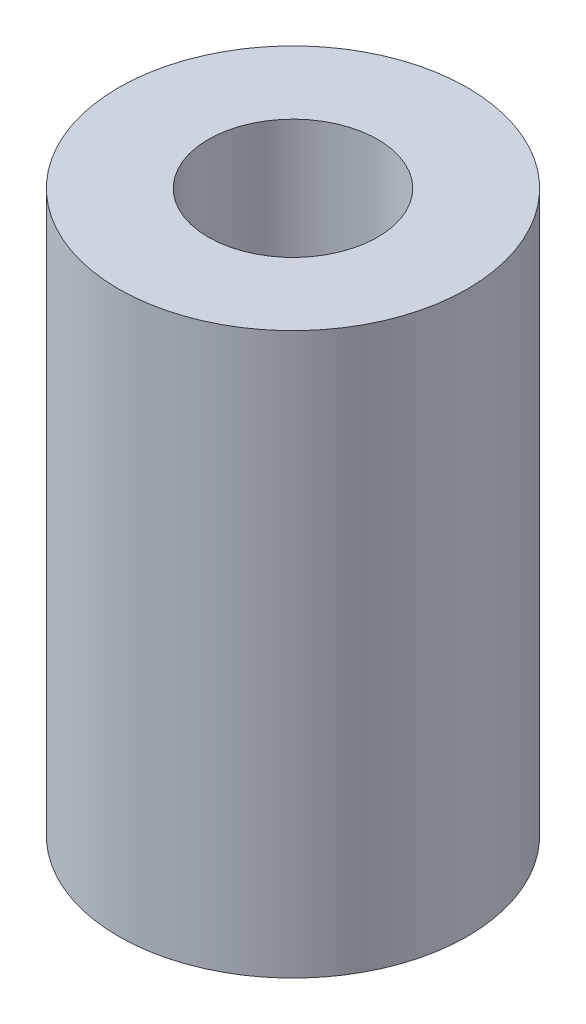
ISO-10303-21;
HEADER;
FILE_DESCRIPTION(('STEP AP214'),'2;1');
FILE_NAME('part.step','',(''),(''),'','','');
FILE_SCHEMA(('AUTOMOTIVE_DESIGN { 1 0 10303 214 1 1 1 1 }'));
ENDSEC;
DATA;
#1=APPLICATION_CONTEXT('core data for automotive mechanical design processes');
#2=APPLICATION_PROTOCOL_DEFINITION('international standard','automotive_design',2000,#1);
#3=PRODUCT_CONTEXT('',#1,'mechanical');
#4=PRODUCT('Part','Part','',(#3));
#5=PRODUCT_RELATED_PRODUCT_CATEGORY('part','',(#4));
#6=PRODUCT_DEFINITION_FORMATION('','',#4);
#7=PRODUCT_DEFINITION_CONTEXT('part definition',#1,'design');
#8=PRODUCT_DEFINITION('design','',#6,#7);
#9=PRODUCT_DEFINITION_SHAPE('','',#8);
#10=(LENGTH_UNIT() NAMED_UNIT(*) SI_UNIT(.MILLI.,.METRE.));
#11=(NAMED_UNIT(*) PLANE_ANGLE_UNIT() SI_UNIT($,.RADIAN.));
#12=(NAMED_UNIT(*) SI_UNIT($,.STERADIAN.) SOLID_ANGLE_UNIT());
#13=UNCERTAINTY_MEASURE_WITH_UNIT(LENGTH_MEASURE(1.E-05),#10,'distance_accuracy_value','');
#14=(GEOMETRIC_REPRESENTATION_CONTEXT(3) GLOBAL_UNCERTAINTY_ASSIGNED_CONTEXT((#13)) GLOBAL_UNIT_ASSIGNED_CONTEXT((#10,
#11,#12)) REPRESENTATION_CONTEXT('',''));
#15=CARTESIAN_POINT('',(0.,0.,0.));
#16=DIRECTION('',(0.,0.,1.));
#17=DIRECTION('',(1.,0.,0.));
#18=AXIS2_PLACEMENT_3D('',#15,#16,#17);
#19=CARTESIAN_POINT('',(0.,11.252,0.));
#20=DIRECTION('',(0.,1.,0.));
#21=DIRECTION('',(0.,0.,1.));
#22=AXIS2_PLACEMENT_3D('',#19,#20,#21);
#23=PLANE('',#22);
#24=CARTESIAN_POINT('',(0.,11.252,0.));
#25=DIRECTION('',(0.,1.,0.));
#26=DIRECTION('',(0.,0.,1.));
#27=AXIS2_PLACEMENT_3D('',#24,#25,#26);
#28=CIRCLE('',#27,3.5);
#29=CARTESIAN_POINT('',(0.,11.252,3.5));
#30=VERTEX_POINT('',#29);
#31=EDGE_CURVE('E10',#30,#30,#28,.T.);
#32=ORIENTED_EDGE('',*,*,#31,.T.);
#33=EDGE_LOOP('',(#32));
#34=FACE_BOUND('',#33,.T.);
#35=CARTESIAN_POINT('',(0.,11.252,0.));
#36=DIRECTION('',(0.,1.,0.));
#37=DIRECTION('',(0.,0.,1.));
#38=AXIS2_PLACEMENT_3D('',#35,#36,#37);
#39=CIRCLE('',#38,1.7);
#40=CARTESIAN_POINT('',(0.,11.252,1.7));
#41=VERTEX_POINT('',#40);
#42=EDGE_CURVE('E48',#41,#41,#39,.T.);
#43=ORIENTED_EDGE('',*,*,#42,.F.);
#44=EDGE_LOOP('',(#43));
#45=FACE_BOUND('',#44,.T.);
#46=ADVANCED_FACE('F37',(#34,#45),#23,.T.);
#47=CARTESIAN_POINT('',(0.,0.,0.));
#48=DIRECTION('',(0.,1.,0.));
#49=DIRECTION('',(0.,0.,1.));
#50=AXIS2_PLACEMENT_3D('',#47,#48,#49);
#51=PLANE('',#50);
#52=CARTESIAN_POINT('',(0.,0.,0.));
#53=DIRECTION('',(0.,1.,0.));
#54=DIRECTION('',(0.,0.,1.));
#55=AXIS2_PLACEMENT_3D('',#52,#53,#54);
#56=CIRCLE('',#55,3.5);
#57=CARTESIAN_POINT('',(0.,0.,3.5));
#58=VERTEX_POINT('',#57);
#59=EDGE_CURVE('E41',#58,#58,#56,.T.);
#60=ORIENTED_EDGE('',*,*,#59,.F.);
#61=EDGE_LOOP('',(#60));
#62=FACE_BOUND('',#61,.T.);
#63=CARTESIAN_POINT('',(0.,0.,0.));
#64=DIRECTION('',(0.,1.,0.));
#65=DIRECTION('',(0.,0.,1.));
#66=AXIS2_PLACEMENT_3D('',#63,#64,#65);
#67=CIRCLE('',#66,1.7);
#68=CARTESIAN_POINT('',(0.,0.,1.7));
#69=VERTEX_POINT('',#68);
#70=EDGE_CURVE('E50',#69,#69,#67,.T.);
#71=ORIENTED_EDGE('',*,*,#70,.T.);
#72=EDGE_LOOP('',(#71));
#73=FACE_BOUND('',#72,.T.);
#74=ADVANCED_FACE('F60',(#62,#73),#51,.F.);
#75=CARTESIAN_POINT('',(0.,11.252,0.));
#76=DIRECTION('',(0.,-1.,0.));
#77=DIRECTION('',(0.,0.,-1.));
#78=AXIS2_PLACEMENT_3D('',#75,#76,#77);
#79=CYLINDRICAL_SURFACE('',#78,3.5);
#80=ORIENTED_EDGE('',*,*,#31,.F.);
#81=EDGE_LOOP('',(#80));
#82=FACE_BOUND('',#81,.T.);
#83=ORIENTED_EDGE('',*,*,#59,.T.);
#84=EDGE_LOOP('',(#83));
#85=FACE_BOUND('',#84,.T.);
#86=ADVANCED_FACE('F39',(#82,#85),#79,.T.);
#87=CARTESIAN_POINT('',(0.,11.252,0.));
#88=DIRECTION('',(0.,-1.,0.));
#89=DIRECTION('',(0.,0.,-1.));
#90=AXIS2_PLACEMENT_3D('',#87,#88,#89);
#91=CYLINDRICAL_SURFACE('',#90,1.7);
#92=ORIENTED_EDGE('',*,*,#42,.T.);
#93=EDGE_LOOP('',(#92));
#94=FACE_BOUND('',#93,.T.);
#95=ORIENTED_EDGE('',*,*,#70,.F.);
#96=EDGE_LOOP('',(#95));
#97=FACE_BOUND('',#96,.T.);
#98=ADVANCED_FACE('F56',(#94,#97),#91,.F.);
#99=CLOSED_SHELL('',(#46,#74,#86,#98));
#100=MANIFOLD_SOLID_BREP('B2',#99);
#101=ADVANCED_BREP_SHAPE_REPRESENTATION('',(#18,#100),#14);
#102=SHAPE_DEFINITION_REPRESENTATION(#9,#101);
ENDSEC;
END-ISO-10303-21;
